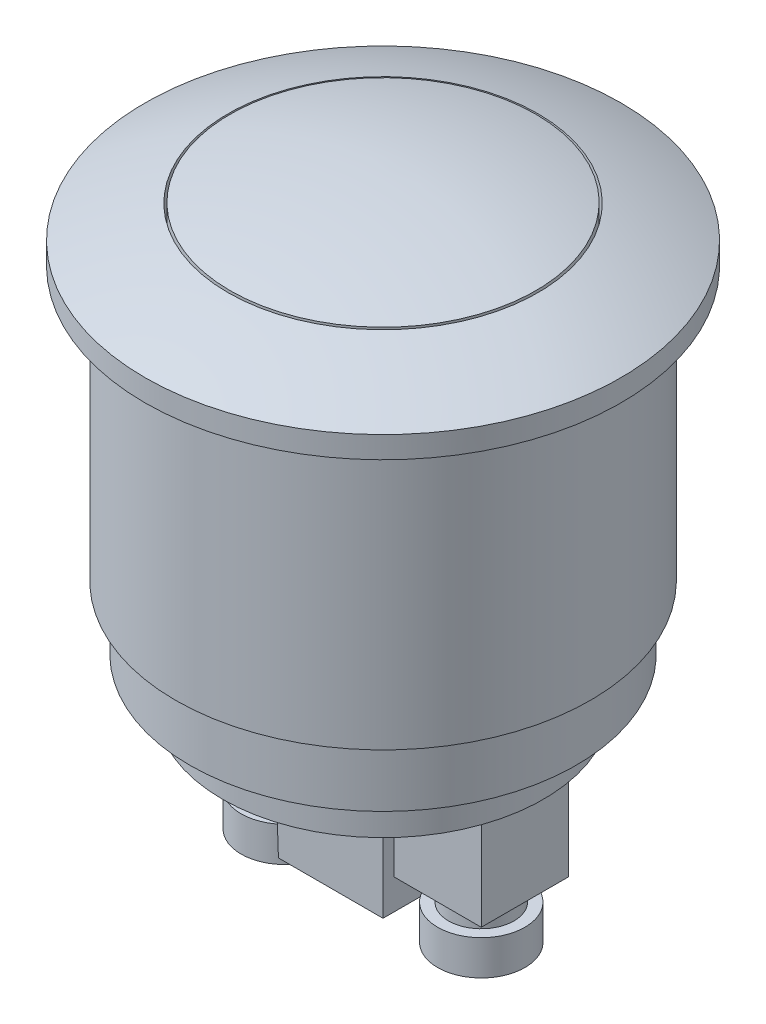
ISO-10303-21;
HEADER;
FILE_DESCRIPTION(('STEP AP214'),'2;1');
FILE_NAME('part.step','',(''),(''),'','','');
FILE_SCHEMA(('AUTOMOTIVE_DESIGN { 1 0 10303 214 1 1 1 1 }'));
ENDSEC;
DATA;
#1=APPLICATION_CONTEXT('core data for automotive mechanical design processes');
#2=APPLICATION_PROTOCOL_DEFINITION('international standard','automotive_design',2000,#1);
#3=PRODUCT_CONTEXT('',#1,'mechanical');
#4=PRODUCT('Part','Part','',(#3));
#5=PRODUCT_RELATED_PRODUCT_CATEGORY('part','',(#4));
#6=PRODUCT_DEFINITION_FORMATION('','',#4);
#7=PRODUCT_DEFINITION_CONTEXT('part definition',#1,'design');
#8=PRODUCT_DEFINITION('design','',#6,#7);
#9=PRODUCT_DEFINITION_SHAPE('','',#8);
#10=(LENGTH_UNIT() NAMED_UNIT(*) SI_UNIT(.MILLI.,.METRE.));
#11=(NAMED_UNIT(*) PLANE_ANGLE_UNIT() SI_UNIT($,.RADIAN.));
#12=(NAMED_UNIT(*) SI_UNIT($,.STERADIAN.) SOLID_ANGLE_UNIT());
#13=UNCERTAINTY_MEASURE_WITH_UNIT(LENGTH_MEASURE(1.E-05),#10,'distance_accuracy_value','');
#14=(GEOMETRIC_REPRESENTATION_CONTEXT(3) GLOBAL_UNCERTAINTY_ASSIGNED_CONTEXT((#13)) GLOBAL_UNIT_ASSIGNED_CONTEXT((#10,
#11,#12)) REPRESENTATION_CONTEXT('',''));
#15=CARTESIAN_POINT('',(0.,0.,0.));
#16=DIRECTION('',(0.,0.,1.));
#17=DIRECTION('',(1.,0.,0.));
#18=AXIS2_PLACEMENT_3D('',#15,#16,#17);
#19=CARTESIAN_POINT('',(0.,-22.,0.));
#20=DIRECTION('',(0.,-1.,0.));
#21=DIRECTION('',(0.,0.,-1.));
#22=AXIS2_PLACEMENT_3D('',#19,#20,#21);
#23=PLANE('',#22);
#24=DIRECTION('',(0.,0.,1.));
#25=VECTOR('',#24,1.);
#26=CARTESIAN_POINT('',(6.5,-22.,0.));
#27=LINE('',#26,#25);
#28=CARTESIAN_POINT('',(6.5,-22.,-2.));
#29=VERTEX_POINT('',#28);
#30=CARTESIAN_POINT('',(6.5,-22.,2.));
#31=VERTEX_POINT('',#30);
#32=EDGE_CURVE('E145',#29,#31,#27,.T.);
#33=ORIENTED_EDGE('',*,*,#32,.T.);
#34=DIRECTION('',(-1.,0.,0.));
#35=VECTOR('',#34,1.);
#36=CARTESIAN_POINT('',(0.,-22.,2.));
#37=LINE('',#36,#35);
#38=CARTESIAN_POINT('',(2.5,-22.,2.));
#39=VERTEX_POINT('',#38);
#40=EDGE_CURVE('E135',#31,#39,#37,.T.);
#41=ORIENTED_EDGE('',*,*,#40,.T.);
#42=DIRECTION('',(0.,0.,-1.));
#43=VECTOR('',#42,1.);
#44=CARTESIAN_POINT('',(2.5,-22.,0.));
#45=LINE('',#44,#43);
#46=CARTESIAN_POINT('',(2.5,-22.,-2.));
#47=VERTEX_POINT('',#46);
#48=EDGE_CURVE('E144',#39,#47,#45,.T.);
#49=ORIENTED_EDGE('',*,*,#48,.T.);
#50=DIRECTION('',(1.,0.,0.));
#51=VECTOR('',#50,1.);
#52=CARTESIAN_POINT('',(0.,-22.,-2.));
#53=LINE('',#52,#51);
#54=EDGE_CURVE('E150',#47,#29,#53,.T.);
#55=ORIENTED_EDGE('',*,*,#54,.T.);
#56=EDGE_LOOP('',(#33,#41,#49,#55));
#57=FACE_BOUND('',#56,.T.);
#58=CARTESIAN_POINT('',(4.5,-22.,0.));
#59=DIRECTION('',(0.,-1.,0.));
#60=DIRECTION('',(0.,0.,1.));
#61=AXIS2_PLACEMENT_3D('',#58,#59,#60);
#62=CIRCLE('',#61,1.5);
#63=CARTESIAN_POINT('',(4.5,-22.,1.5));
#64=VERTEX_POINT('',#63);
#65=EDGE_CURVE('E278',#64,#64,#62,.T.);
#66=ORIENTED_EDGE('',*,*,#65,.F.);
#67=EDGE_LOOP('',(#66));
#68=FACE_BOUND('',#67,.T.);
#69=ADVANCED_FACE('F41',(#57,#68),#23,.T.);
#70=CARTESIAN_POINT('',(0.,-17.5,0.));
#71=DIRECTION('',(0.,1.,0.));
#72=DIRECTION('',(0.,0.,1.));
#73=AXIS2_PLACEMENT_3D('',#70,#71,#72);
#74=PLANE('',#73);
#75=CARTESIAN_POINT('',(0.,-17.5,0.));
#76=DIRECTION('',(0.,1.,0.));
#77=DIRECTION('',(0.,0.,1.));
#78=AXIS2_PLACEMENT_3D('',#75,#76,#77);
#79=CIRCLE('',#78,7.35);
#80=CARTESIAN_POINT('',(0.,-17.5,7.35));
#81=VERTEX_POINT('',#80);
#82=EDGE_CURVE('E212',#81,#81,#79,.T.);
#83=ORIENTED_EDGE('',*,*,#82,.F.);
#84=EDGE_LOOP('',(#83));
#85=FACE_BOUND('',#84,.T.);
#86=DIRECTION('',(-1.,0.,0.));
#87=VECTOR('',#86,1.);
#88=CARTESIAN_POINT('',(0.,-17.5,2.));
#89=LINE('',#88,#87);
#90=CARTESIAN_POINT('',(6.5,-17.5,2.));
#91=VERTEX_POINT('',#90);
#92=CARTESIAN_POINT('',(2.5,-17.5,2.));
#93=VERTEX_POINT('',#92);
#94=EDGE_CURVE('E58',#91,#93,#89,.T.);
#95=ORIENTED_EDGE('',*,*,#94,.F.);
#96=DIRECTION('',(0.,0.,1.));
#97=VECTOR('',#96,1.);
#98=CARTESIAN_POINT('',(6.5,-17.5,0.));
#99=LINE('',#98,#97);
#100=CARTESIAN_POINT('',(6.5,-17.5,-2.));
#101=VERTEX_POINT('',#100);
#102=EDGE_CURVE('E63',#101,#91,#99,.T.);
#103=ORIENTED_EDGE('',*,*,#102,.F.);
#104=DIRECTION('',(1.,0.,0.));
#105=VECTOR('',#104,1.);
#106=CARTESIAN_POINT('',(0.,-17.5,-2.));
#107=LINE('',#106,#105);
#108=CARTESIAN_POINT('',(2.5,-17.5,-2.));
#109=VERTEX_POINT('',#108);
#110=EDGE_CURVE('E154',#109,#101,#107,.T.);
#111=ORIENTED_EDGE('',*,*,#110,.F.);
#112=DIRECTION('',(0.,0.,-1.));
#113=VECTOR('',#112,1.);
#114=CARTESIAN_POINT('',(2.5,-17.5,0.));
#115=LINE('',#114,#113);
#116=CARTESIAN_POINT('',(2.5,-17.5,-2.5));
#117=VERTEX_POINT('',#116);
#118=EDGE_CURVE('E187',#109,#117,#115,.T.);
#119=ORIENTED_EDGE('',*,*,#118,.T.);
#120=DIRECTION('',(-1.,0.,0.));
#121=VECTOR('',#120,1.);
#122=CARTESIAN_POINT('',(0.,-17.5,-2.5));
#123=LINE('',#122,#121);
#124=CARTESIAN_POINT('',(-2.5,-17.5,-2.5));
#125=VERTEX_POINT('',#124);
#126=EDGE_CURVE('E198',#117,#125,#123,.T.);
#127=ORIENTED_EDGE('',*,*,#126,.T.);
#128=DIRECTION('',(0.,0.,1.));
#129=VECTOR('',#128,1.);
#130=CARTESIAN_POINT('',(-2.5,-17.5,0.));
#131=LINE('',#130,#129);
#132=CARTESIAN_POINT('',(-2.5,-17.5,-2.));
#133=VERTEX_POINT('',#132);
#134=EDGE_CURVE('E203',#125,#133,#131,.T.);
#135=ORIENTED_EDGE('',*,*,#134,.T.);
#136=DIRECTION('',(-1.,0.,0.));
#137=VECTOR('',#136,1.);
#138=CARTESIAN_POINT('',(0.,-17.5,-2.));
#139=LINE('',#138,#137);
#140=CARTESIAN_POINT('',(-6.5,-17.5,-2.));
#141=VERTEX_POINT('',#140);
#142=EDGE_CURVE('E159',#133,#141,#139,.T.);
#143=ORIENTED_EDGE('',*,*,#142,.T.);
#144=DIRECTION('',(0.,0.,1.));
#145=VECTOR('',#144,1.);
#146=CARTESIAN_POINT('',(-6.5,-17.5,0.));
#147=LINE('',#146,#145);
#148=CARTESIAN_POINT('',(-6.5,-17.5,2.));
#149=VERTEX_POINT('',#148);
#150=EDGE_CURVE('E180',#141,#149,#147,.T.);
#151=ORIENTED_EDGE('',*,*,#150,.T.);
#152=DIRECTION('',(1.,0.,0.));
#153=VECTOR('',#152,1.);
#154=CARTESIAN_POINT('',(0.,-17.5,2.));
#155=LINE('',#154,#153);
#156=CARTESIAN_POINT('',(-2.5,-17.5,2.));
#157=VERTEX_POINT('',#156);
#158=EDGE_CURVE('E169',#149,#157,#155,.T.);
#159=ORIENTED_EDGE('',*,*,#158,.T.);
#160=CARTESIAN_POINT('',(-2.5,-17.5,2.5));
#161=VERTEX_POINT('',#160);
#162=EDGE_CURVE('E202',#157,#161,#131,.T.);
#163=ORIENTED_EDGE('',*,*,#162,.T.);
#164=DIRECTION('',(1.,0.,0.));
#165=VECTOR('',#164,1.);
#166=CARTESIAN_POINT('',(0.,-17.5,2.5));
#167=LINE('',#166,#165);
#168=CARTESIAN_POINT('',(2.5,-17.5,2.5));
#169=VERTEX_POINT('',#168);
#170=EDGE_CURVE('E206',#161,#169,#167,.T.);
#171=ORIENTED_EDGE('',*,*,#170,.T.);
#172=EDGE_CURVE('E196',#169,#93,#115,.T.);
#173=ORIENTED_EDGE('',*,*,#172,.T.);
#174=EDGE_LOOP('',(#95,#103,#111,#119,#127,#135,#143,#151,#159,#163,#171,#173));
#175=FACE_BOUND('',#174,.T.);
#176=ADVANCED_FACE('F325',(#85,#175),#74,.F.);
#177=CARTESIAN_POINT('',(0.,1.,0.));
#178=DIRECTION('',(0.,-1.,0.));
#179=DIRECTION('',(0.,0.,-1.));
#180=AXIS2_PLACEMENT_3D('',#177,#178,#179);
#181=CYLINDRICAL_SURFACE('',#180,10.9);
#182=CARTESIAN_POINT('',(0.,1.,0.));
#183=DIRECTION('',(0.,1.,0.));
#184=DIRECTION('',(0.,0.,1.));
#185=AXIS2_PLACEMENT_3D('',#182,#183,#184);
#186=CIRCLE('',#185,10.9);
#187=CARTESIAN_POINT('',(0.,1.,10.9));
#188=VERTEX_POINT('',#187);
#189=EDGE_CURVE('E11',#188,#188,#186,.T.);
#190=ORIENTED_EDGE('',*,*,#189,.F.);
#191=EDGE_LOOP('',(#190));
#192=FACE_BOUND('',#191,.T.);
#193=CARTESIAN_POINT('',(0.,0.,0.));
#194=DIRECTION('',(0.,1.,0.));
#195=DIRECTION('',(0.,0.,1.));
#196=AXIS2_PLACEMENT_3D('',#193,#194,#195);
#197=CIRCLE('',#196,10.9);
#198=CARTESIAN_POINT('',(0.,0.,10.9));
#199=VERTEX_POINT('',#198);
#200=EDGE_CURVE('E50',#199,#199,#197,.T.);
#201=ORIENTED_EDGE('',*,*,#200,.T.);
#202=EDGE_LOOP('',(#201));
#203=FACE_BOUND('',#202,.T.);
#204=ADVANCED_FACE('F372',(#192,#203),#181,.T.);
#205=CARTESIAN_POINT('',(0.,-21.512,0.));
#206=DIRECTION('',(0.,0.,1.));
#207=DIRECTION('',(1.,0.,0.));
#208=AXIS2_PLACEMENT_3D('',#205,#206,#207);
#209=SPHERICAL_SURFACE('',#208,25.012);
#210=CARTESIAN_POINT('',(0.,-21.512,0.));
#211=DIRECTION('',(0.,-1.,0.));
#212=DIRECTION('',(0.,0.,-1.));
#213=AXIS2_PLACEMENT_3D('',#210,#211,#212);
#214=SPHERICAL_SURFACE('',#213,25.012);
#215=CARTESIAN_POINT('',(0.,2.47112206531919,0.));
#216=DIRECTION('',(0.,-1.,0.));
#217=DIRECTION('',(0.,0.,-1.));
#218=AXIS2_PLACEMENT_3D('',#215,#216,#217);
#219=CIRCLE('',#218,7.1);
#220=CARTESIAN_POINT('',(0.,2.47112206531919,-7.1));
#221=VERTEX_POINT('',#220);
#222=EDGE_CURVE('E45',#221,#221,#219,.F.);
#223=ORIENTED_EDGE('',*,*,#222,.F.);
#224=EDGE_LOOP('',(#223));
#225=FACE_BOUND('',#224,.T.);
#226=ORIENTED_EDGE('',*,*,#189,.T.);
#227=EDGE_LOOP('',(#226));
#228=FACE_BOUND('',#227,.T.);
#229=ADVANCED_FACE('F43',(#225,#228),#214,.T.);
#230=CARTESIAN_POINT('',(0.,0.,0.));
#231=DIRECTION('',(0.,1.,0.));
#232=DIRECTION('',(0.,0.,1.));
#233=AXIS2_PLACEMENT_3D('',#230,#231,#232);
#234=PLANE('',#233);
#235=CARTESIAN_POINT('',(0.,0.,0.));
#236=DIRECTION('',(0.,1.,0.));
#237=DIRECTION('',(0.,0.,1.));
#238=AXIS2_PLACEMENT_3D('',#235,#236,#237);
#239=CIRCLE('',#238,9.5);
#240=CARTESIAN_POINT('',(0.,0.,9.5));
#241=VERTEX_POINT('',#240);
#242=EDGE_CURVE('E247',#241,#241,#239,.T.);
#243=ORIENTED_EDGE('',*,*,#242,.T.);
#244=EDGE_LOOP('',(#243));
#245=FACE_BOUND('',#244,.T.);
#246=ORIENTED_EDGE('',*,*,#200,.F.);
#247=EDGE_LOOP('',(#246));
#248=FACE_BOUND('',#247,.T.);
#249=ADVANCED_FACE('F505',(#245,#248),#234,.F.);
#250=CARTESIAN_POINT('',(0.,-12.5,0.));
#251=DIRECTION('',(0.,1.,0.));
#252=DIRECTION('',(0.,0.,1.));
#253=AXIS2_PLACEMENT_3D('',#250,#251,#252);
#254=CYLINDRICAL_SURFACE('',#253,9.5);
#255=CARTESIAN_POINT('',(0.,-12.5,0.));
#256=DIRECTION('',(0.,1.,0.));
#257=DIRECTION('',(0.,0.,1.));
#258=AXIS2_PLACEMENT_3D('',#255,#256,#257);
#259=CIRCLE('',#258,9.5);
#260=CARTESIAN_POINT('',(0.,-12.5,9.5));
#261=VERTEX_POINT('',#260);
#262=EDGE_CURVE('E243',#261,#261,#259,.T.);
#263=ORIENTED_EDGE('',*,*,#262,.T.);
#264=EDGE_LOOP('',(#263));
#265=FACE_BOUND('',#264,.T.);
#266=ORIENTED_EDGE('',*,*,#242,.F.);
#267=EDGE_LOOP('',(#266));
#268=FACE_BOUND('',#267,.T.);
#269=ADVANCED_FACE('F652',(#265,#268),#254,.T.);
#270=CARTESIAN_POINT('',(0.,-12.5,0.));
#271=DIRECTION('',(0.,1.,0.));
#272=DIRECTION('',(0.,0.,1.));
#273=AXIS2_PLACEMENT_3D('',#270,#271,#272);
#274=PLANE('',#273);
#275=CARTESIAN_POINT('',(0.,-12.5,0.));
#276=DIRECTION('',(0.,1.,0.));
#277=DIRECTION('',(0.,0.,1.));
#278=AXIS2_PLACEMENT_3D('',#275,#276,#277);
#279=CIRCLE('',#278,8.85);
#280=CARTESIAN_POINT('',(0.,-12.5,8.85));
#281=VERTEX_POINT('',#280);
#282=EDGE_CURVE('E242',#281,#281,#279,.T.);
#283=ORIENTED_EDGE('',*,*,#282,.T.);
#284=EDGE_LOOP('',(#283));
#285=FACE_BOUND('',#284,.T.);
#286=ORIENTED_EDGE('',*,*,#262,.F.);
#287=EDGE_LOOP('',(#286));
#288=FACE_BOUND('',#287,.T.);
#289=ADVANCED_FACE('F643',(#285,#288),#274,.F.);
#290=CARTESIAN_POINT('',(0.,-15.4,0.));
#291=DIRECTION('',(0.,1.,0.));
#292=DIRECTION('',(0.,0.,1.));
#293=AXIS2_PLACEMENT_3D('',#290,#291,#292);
#294=CYLINDRICAL_SURFACE('',#293,8.85);
#295=CARTESIAN_POINT('',(0.,-15.4,0.));
#296=DIRECTION('',(0.,1.,0.));
#297=DIRECTION('',(0.,0.,1.));
#298=AXIS2_PLACEMENT_3D('',#295,#296,#297);
#299=CIRCLE('',#298,8.85);
#300=CARTESIAN_POINT('',(0.,-15.4,8.85));
#301=VERTEX_POINT('',#300);
#302=EDGE_CURVE('E238',#301,#301,#299,.T.);
#303=CARTESIAN_POINT('',(0.,-15.4,8.85));
#304=CARTESIAN_POINT('',(0.,-15.3697916666667,8.85));
#305=CARTESIAN_POINT('',(0.,-15.3395833333333,8.85));
#306=CARTESIAN_POINT('',(0.,-15.2791666666667,8.85));
#307=CARTESIAN_POINT('',(0.,-15.2489583333333,8.85));
#308=CARTESIAN_POINT('',(0.,-15.1885416666667,8.85));
#309=CARTESIAN_POINT('',(0.,-15.1583333333333,8.85));
#310=CARTESIAN_POINT('',(0.,-15.0979166666667,8.85));
#311=CARTESIAN_POINT('',(0.,-15.0677083333333,8.85));
#312=CARTESIAN_POINT('',(0.,-15.0072916666667,8.85));
#313=CARTESIAN_POINT('',(0.,-14.9770833333333,8.85));
#314=CARTESIAN_POINT('',(0.,-14.9166666666667,8.85));
#315=CARTESIAN_POINT('',(0.,-14.8864583333333,8.85));
#316=CARTESIAN_POINT('',(0.,-14.8260416666667,8.85));
#317=CARTESIAN_POINT('',(0.,-14.7958333333333,8.85));
#318=CARTESIAN_POINT('',(0.,-14.7354166666667,8.85));
#319=CARTESIAN_POINT('',(0.,-14.7052083333333,8.85));
#320=CARTESIAN_POINT('',(0.,-14.6447916666667,8.85));
#321=CARTESIAN_POINT('',(0.,-14.6145833333333,8.85));
#322=CARTESIAN_POINT('',(0.,-14.5541666666667,8.85));
#323=CARTESIAN_POINT('',(0.,-14.5239583333333,8.85));
#324=CARTESIAN_POINT('',(0.,-14.4635416666667,8.85));
#325=CARTESIAN_POINT('',(0.,-14.4333333333333,8.85));
#326=CARTESIAN_POINT('',(0.,-14.3729166666667,8.85));
#327=CARTESIAN_POINT('',(0.,-14.3427083333333,8.85));
#328=CARTESIAN_POINT('',(0.,-14.2822916666667,8.85));
#329=CARTESIAN_POINT('',(0.,-14.2520833333333,8.85));
#330=CARTESIAN_POINT('',(0.,-14.1916666666667,8.85));
#331=CARTESIAN_POINT('',(0.,-14.1614583333333,8.85));
#332=CARTESIAN_POINT('',(0.,-14.1010416666667,8.85));
#333=CARTESIAN_POINT('',(0.,-14.0708333333333,8.85));
#334=CARTESIAN_POINT('',(0.,-14.0104166666667,8.85));
#335=CARTESIAN_POINT('',(0.,-13.9802083333333,8.85));
#336=CARTESIAN_POINT('',(0.,-13.9197916666667,8.85));
#337=CARTESIAN_POINT('',(0.,-13.8895833333333,8.85));
#338=CARTESIAN_POINT('',(0.,-13.8291666666667,8.85));
#339=CARTESIAN_POINT('',(0.,-13.7989583333333,8.85));
#340=CARTESIAN_POINT('',(0.,-13.7385416666667,8.85));
#341=CARTESIAN_POINT('',(0.,-13.7083333333333,8.85));
#342=CARTESIAN_POINT('',(0.,-13.6479166666667,8.85));
#343=CARTESIAN_POINT('',(0.,-13.6177083333333,8.85));
#344=CARTESIAN_POINT('',(0.,-13.5572916666667,8.85));
#345=CARTESIAN_POINT('',(0.,-13.5270833333333,8.85));
#346=CARTESIAN_POINT('',(0.,-13.4666666666667,8.85));
#347=CARTESIAN_POINT('',(0.,-13.4364583333333,8.85));
#348=CARTESIAN_POINT('',(0.,-13.3760416666667,8.85));
#349=CARTESIAN_POINT('',(0.,-13.3458333333333,8.85));
#350=CARTESIAN_POINT('',(0.,-13.2854166666667,8.85));
#351=CARTESIAN_POINT('',(0.,-13.2552083333333,8.85));
#352=CARTESIAN_POINT('',(0.,-13.1947916666667,8.85));
#353=CARTESIAN_POINT('',(0.,-13.1645833333333,8.85));
#354=CARTESIAN_POINT('',(0.,-13.1041666666667,8.85));
#355=CARTESIAN_POINT('',(0.,-13.0739583333333,8.85));
#356=CARTESIAN_POINT('',(0.,-13.0135416666667,8.85));
#357=CARTESIAN_POINT('',(0.,-12.9833333333333,8.85));
#358=CARTESIAN_POINT('',(0.,-12.9229166666667,8.85));
#359=CARTESIAN_POINT('',(0.,-12.8927083333333,8.85));
#360=CARTESIAN_POINT('',(0.,-12.8322916666667,8.85));
#361=CARTESIAN_POINT('',(0.,-12.8020833333333,8.85));
#362=CARTESIAN_POINT('',(0.,-12.7416666666667,8.85));
#363=CARTESIAN_POINT('',(0.,-12.7114583333333,8.85));
#364=CARTESIAN_POINT('',(0.,-12.6510416666667,8.85));
#365=CARTESIAN_POINT('',(0.,-12.6208333333333,8.85));
#366=CARTESIAN_POINT('',(0.,-12.5604166666667,8.85));
#367=CARTESIAN_POINT('',(0.,-12.5302083333333,8.85));
#368=CARTESIAN_POINT('',(0.,-12.5,8.85));
#369=B_SPLINE_CURVE_WITH_KNOTS('',3,(#303,#304,#305,#306,#307,#308,#309,#310,#311,#312,#313,
#314,#315,#316,#317,#318,#319,#320,#321,#322,#323,#324,#325,#326,#327,#328,#329,#330,#331,#332,
#333,#334,#335,#336,#337,#338,#339,#340,#341,#342,#343,#344,#345,#346,#347,#348,#349,#350,#351,
#352,#353,#354,#355,#356,#357,#358,#359,#360,#361,#362,#363,#364,#365,#366,#367,#368),
.UNSPECIFIED.,.F.,.F.,(4,2,2,2,2,2,2,2,2,2,2,2,2,2,2,2,2,2,2,2,2,2,2,2,2,2,2,2,2,2,2,2,4),(0.,
0.0906250000000004,0.181250000000001,0.271875000000001,0.3625,0.453125,0.543750000000001,
0.634375000000001,0.725,0.815625,0.906250000000001,0.996875000000001,1.0875,1.178125,1.26875,
1.359375,1.45,1.540625,1.63125,1.721875,1.8125,1.903125,1.99375,2.084375,2.175,2.265625,2.35625,
2.446875,2.5375,2.628125,2.71875,2.809375,2.9),.UNSPECIFIED.);
#370=EDGE_CURVE('BSEAM634',#301,#281,#369,.T.);
#371=ORIENTED_EDGE('',*,*,#302,.T.);
#372=ORIENTED_EDGE('',*,*,#282,.F.);
#373=ORIENTED_EDGE('',*,*,#370,.T.);
#374=ORIENTED_EDGE('',*,*,#370,.F.);
#375=EDGE_LOOP('',(#371,#373,#372,#374));
#376=FACE_BOUND('',#375,.T.);
#377=ADVANCED_FACE('F634',(#376),#294,.T.);
#378=CARTESIAN_POINT('',(0.,-15.4,0.));
#379=DIRECTION('',(0.,1.,0.));
#380=DIRECTION('',(0.,0.,1.));
#381=AXIS2_PLACEMENT_3D('',#378,#379,#380);
#382=PLANE('',#381);
#383=CARTESIAN_POINT('',(0.,-15.4,0.));
#384=DIRECTION('',(0.,1.,0.));
#385=DIRECTION('',(0.,0.,1.));
#386=AXIS2_PLACEMENT_3D('',#383,#384,#385);
#387=CIRCLE('',#386,7.35);
#388=CARTESIAN_POINT('',(0.,-15.4,7.35));
#389=VERTEX_POINT('',#388);
#390=EDGE_CURVE('E237',#389,#389,#387,.T.);
#391=ORIENTED_EDGE('',*,*,#390,.T.);
#392=EDGE_LOOP('',(#391));
#393=FACE_BOUND('',#392,.T.);
#394=ORIENTED_EDGE('',*,*,#302,.F.);
#395=EDGE_LOOP('',(#394));
#396=FACE_BOUND('',#395,.T.);
#397=ADVANCED_FACE('F625',(#393,#396),#382,.F.);
#398=CARTESIAN_POINT('',(0.,-17.5,0.));
#399=DIRECTION('',(0.,1.,0.));
#400=DIRECTION('',(0.,0.,1.));
#401=AXIS2_PLACEMENT_3D('',#398,#399,#400);
#402=CYLINDRICAL_SURFACE('',#401,7.35);
#403=ORIENTED_EDGE('',*,*,#82,.T.);
#404=EDGE_LOOP('',(#403));
#405=FACE_BOUND('',#404,.T.);
#406=ORIENTED_EDGE('',*,*,#390,.F.);
#407=EDGE_LOOP('',(#406));
#408=FACE_BOUND('',#407,.T.);
#409=ADVANCED_FACE('F618',(#405,#408),#402,.T.);
#410=CARTESIAN_POINT('',(2.5,-17.5,0.));
#411=DIRECTION('',(0.999847695156391,-0.0174524064372835,0.));
#412=DIRECTION('',(0.0174524064372835,0.999847695156391,0.));
#413=AXIS2_PLACEMENT_3D('',#410,#411,#412);
#414=PLANE('',#413);
#415=ORIENTED_EDGE('',*,*,#172,.F.);
#416=DIRECTION('',(0.0174497491606827,0.999695459881887,0.0174497491606827));
#417=VECTOR('',#416,1.);
#418=CARTESIAN_POINT('',(2.49923876563557,-17.54361108753,2.49923876563557));
#419=LINE('',#418,#417);
#420=CARTESIAN_POINT('',(2.39526961043069,-23.5,2.39526961043069));
#421=VERTEX_POINT('',#420);
#422=EDGE_CURVE('E210',#421,#169,#419,.T.);
#423=ORIENTED_EDGE('',*,*,#422,.F.);
#424=DIRECTION('',(0.,0.,-1.));
#425=VECTOR('',#424,1.);
#426=CARTESIAN_POINT('',(2.39526961043069,-23.5,0.));
#427=LINE('',#426,#425);
#428=CARTESIAN_POINT('',(2.39526961043069,-23.5,-2.39526961043069));
#429=VERTEX_POINT('',#428);
#430=EDGE_CURVE('E209',#421,#429,#427,.T.);
#431=ORIENTED_EDGE('',*,*,#430,.T.);
#432=DIRECTION('',(0.0174497491606827,0.999695459881887,-0.0174497491606827));
#433=VECTOR('',#432,1.);
#434=CARTESIAN_POINT('',(2.49923876563557,-17.54361108753,-2.49923876563557));
#435=LINE('',#434,#433);
#436=EDGE_CURVE('E214',#429,#117,#435,.T.);
#437=ORIENTED_EDGE('',*,*,#436,.T.);
#438=ORIENTED_EDGE('',*,*,#118,.F.);
#439=DIRECTION('',(0.,0.,-1.));
#440=VECTOR('',#439,1.);
#441=CARTESIAN_POINT('',(2.5,-17.5,0.));
#442=LINE('',#441,#440);
#443=EDGE_CURVE('E308',#93,#109,#442,.T.);
#444=ORIENTED_EDGE('',*,*,#443,.F.);
#445=EDGE_LOOP('',(#415,#423,#431,#437,#438,#444));
#446=FACE_BOUND('',#445,.T.);
#447=ADVANCED_FACE('F324',(#446),#414,.T.);
#448=CARTESIAN_POINT('',(0.,-17.5,2.5));
#449=DIRECTION('',(0.,-0.0174524064372835,0.999847695156391));
#450=DIRECTION('',(0.,-0.999847695156391,-0.0174524064372835));
#451=AXIS2_PLACEMENT_3D('',#448,#449,#450);
#452=PLANE('',#451);
#453=ORIENTED_EDGE('',*,*,#170,.F.);
#454=DIRECTION('',(-0.0174497491606827,0.999695459881887,0.0174497491606827));
#455=VECTOR('',#454,1.);
#456=CARTESIAN_POINT('',(-2.49923876563557,-17.54361108753,2.49923876563557));
#457=LINE('',#456,#455);
#458=CARTESIAN_POINT('',(-2.39526961043069,-23.5,2.39526961043069));
#459=VERTEX_POINT('',#458);
#460=EDGE_CURVE('E213',#459,#161,#457,.T.);
#461=ORIENTED_EDGE('',*,*,#460,.F.);
#462=DIRECTION('',(1.,0.,0.));
#463=VECTOR('',#462,1.);
#464=CARTESIAN_POINT('',(0.,-23.5,2.39526961043069));
#465=LINE('',#464,#463);
#466=EDGE_CURVE('E219',#459,#421,#465,.T.);
#467=ORIENTED_EDGE('',*,*,#466,.T.);
#468=ORIENTED_EDGE('',*,*,#422,.T.);
#469=EDGE_LOOP('',(#453,#461,#467,#468));
#470=FACE_BOUND('',#469,.T.);
#471=ADVANCED_FACE('F328',(#470),#452,.T.);
#472=CARTESIAN_POINT('',(-2.5,-17.5,0.));
#473=DIRECTION('',(-0.999847695156391,-0.0174524064372835,0.));
#474=DIRECTION('',(0.0174524064372835,-0.999847695156391,0.));
#475=AXIS2_PLACEMENT_3D('',#472,#473,#474);
#476=PLANE('',#475);
#477=ORIENTED_EDGE('',*,*,#134,.F.);
#478=DIRECTION('',(-0.0174497491606827,0.999695459881887,-0.0174497491606827));
#479=VECTOR('',#478,1.);
#480=CARTESIAN_POINT('',(-2.49923876563557,-17.54361108753,-2.49923876563557));
#481=LINE('',#480,#479);
#482=CARTESIAN_POINT('',(-2.39526961043069,-23.5,-2.39526961043069));
#483=VERTEX_POINT('',#482);
#484=EDGE_CURVE('E218',#483,#125,#481,.T.);
#485=ORIENTED_EDGE('',*,*,#484,.F.);
#486=DIRECTION('',(0.,0.,1.));
#487=VECTOR('',#486,1.);
#488=CARTESIAN_POINT('',(-2.39526961043069,-23.5,0.));
#489=LINE('',#488,#487);
#490=EDGE_CURVE('E230',#483,#459,#489,.T.);
#491=ORIENTED_EDGE('',*,*,#490,.T.);
#492=ORIENTED_EDGE('',*,*,#460,.T.);
#493=ORIENTED_EDGE('',*,*,#162,.F.);
#494=DIRECTION('',(0.,0.,-1.));
#495=VECTOR('',#494,1.);
#496=CARTESIAN_POINT('',(-2.5,-17.5,0.));
#497=LINE('',#496,#495);
#498=EDGE_CURVE('E157',#157,#133,#497,.T.);
#499=ORIENTED_EDGE('',*,*,#498,.T.);
#500=EDGE_LOOP('',(#477,#485,#491,#492,#493,#499));
#501=FACE_BOUND('',#500,.T.);
#502=ADVANCED_FACE('F597',(#501),#476,.T.);
#503=CARTESIAN_POINT('',(0.,-17.5,-2.5));
#504=DIRECTION('',(0.,-0.0174524064372835,-0.999847695156391));
#505=DIRECTION('',(0.,0.999847695156391,-0.0174524064372835));
#506=AXIS2_PLACEMENT_3D('',#503,#504,#505);
#507=PLANE('',#506);
#508=ORIENTED_EDGE('',*,*,#126,.F.);
#509=ORIENTED_EDGE('',*,*,#436,.F.);
#510=DIRECTION('',(-1.,0.,0.));
#511=VECTOR('',#510,1.);
#512=CARTESIAN_POINT('',(0.,-23.5,-2.39526961043069));
#513=LINE('',#512,#511);
#514=EDGE_CURVE('E227',#429,#483,#513,.T.);
#515=ORIENTED_EDGE('',*,*,#514,.T.);
#516=ORIENTED_EDGE('',*,*,#484,.T.);
#517=EDGE_LOOP('',(#508,#509,#515,#516));
#518=FACE_BOUND('',#517,.T.);
#519=ADVANCED_FACE('F337',(#518),#507,.T.);
#520=CARTESIAN_POINT('',(0.,-23.5,0.));
#521=DIRECTION('',(0.,1.,0.));
#522=DIRECTION('',(0.,0.,1.));
#523=AXIS2_PLACEMENT_3D('',#520,#521,#522);
#524=PLANE('',#523);
#525=ORIENTED_EDGE('',*,*,#430,.F.);
#526=ORIENTED_EDGE('',*,*,#466,.F.);
#527=ORIENTED_EDGE('',*,*,#490,.F.);
#528=ORIENTED_EDGE('',*,*,#514,.F.);
#529=EDGE_LOOP('',(#525,#526,#527,#528));
#530=FACE_BOUND('',#529,.T.);
#531=ADVANCED_FACE('F333',(#530),#524,.F.);
#532=CARTESIAN_POINT('',(-2.5,-22.,0.));
#533=DIRECTION('',(1.,0.,0.));
#534=DIRECTION('',(0.,0.,-1.));
#535=AXIS2_PLACEMENT_3D('',#532,#533,#534);
#536=PLANE('',#535);
#537=ORIENTED_EDGE('',*,*,#498,.F.);
#538=DIRECTION('',(0.,1.,0.));
#539=VECTOR('',#538,1.);
#540=CARTESIAN_POINT('',(-2.5,-22.,2.));
#541=LINE('',#540,#539);
#542=CARTESIAN_POINT('',(-2.5,-22.,2.));
#543=VERTEX_POINT('',#542);
#544=EDGE_CURVE('E184',#543,#157,#541,.T.);
#545=ORIENTED_EDGE('',*,*,#544,.F.);
#546=DIRECTION('',(0.,0.,-1.));
#547=VECTOR('',#546,1.);
#548=CARTESIAN_POINT('',(-2.5,-22.,0.));
#549=LINE('',#548,#547);
#550=CARTESIAN_POINT('',(-2.5,-22.,-2.));
#551=VERTEX_POINT('',#550);
#552=EDGE_CURVE('E165',#543,#551,#549,.T.);
#553=ORIENTED_EDGE('',*,*,#552,.T.);
#554=DIRECTION('',(0.,1.,0.));
#555=VECTOR('',#554,1.);
#556=CARTESIAN_POINT('',(-2.5,-22.,-2.));
#557=LINE('',#556,#555);
#558=EDGE_CURVE('E177',#551,#133,#557,.T.);
#559=ORIENTED_EDGE('',*,*,#558,.T.);
#560=EDGE_LOOP('',(#537,#545,#553,#559));
#561=FACE_BOUND('',#560,.T.);
#562=ADVANCED_FACE('F342',(#561),#536,.T.);
#563=CARTESIAN_POINT('',(0.,-22.,2.));
#564=DIRECTION('',(0.,0.,1.));
#565=DIRECTION('',(1.,0.,0.));
#566=AXIS2_PLACEMENT_3D('',#563,#564,#565);
#567=PLANE('',#566);
#568=ORIENTED_EDGE('',*,*,#158,.F.);
#569=DIRECTION('',(0.,1.,0.));
#570=VECTOR('',#569,1.);
#571=CARTESIAN_POINT('',(-6.5,-22.,2.));
#572=LINE('',#571,#570);
#573=CARTESIAN_POINT('',(-6.5,-22.,2.));
#574=VERTEX_POINT('',#573);
#575=EDGE_CURVE('E188',#574,#149,#572,.T.);
#576=ORIENTED_EDGE('',*,*,#575,.F.);
#577=DIRECTION('',(1.,0.,0.));
#578=VECTOR('',#577,1.);
#579=CARTESIAN_POINT('',(0.,-22.,2.));
#580=LINE('',#579,#578);
#581=EDGE_CURVE('E175',#574,#543,#580,.T.);
#582=ORIENTED_EDGE('',*,*,#581,.T.);
#583=ORIENTED_EDGE('',*,*,#544,.T.);
#584=EDGE_LOOP('',(#568,#576,#582,#583));
#585=FACE_BOUND('',#584,.T.);
#586=ADVANCED_FACE('F353',(#585),#567,.T.);
#587=CARTESIAN_POINT('',(-6.5,-22.,0.));
#588=DIRECTION('',(-1.,0.,0.));
#589=DIRECTION('',(0.,0.,1.));
#590=AXIS2_PLACEMENT_3D('',#587,#588,#589);
#591=PLANE('',#590);
#592=ORIENTED_EDGE('',*,*,#150,.F.);
#593=DIRECTION('',(0.,1.,0.));
#594=VECTOR('',#593,1.);
#595=CARTESIAN_POINT('',(-6.5,-22.,-2.));
#596=LINE('',#595,#594);
#597=CARTESIAN_POINT('',(-6.5,-22.,-2.));
#598=VERTEX_POINT('',#597);
#599=EDGE_CURVE('E191',#598,#141,#596,.T.);
#600=ORIENTED_EDGE('',*,*,#599,.F.);
#601=DIRECTION('',(0.,0.,1.));
#602=VECTOR('',#601,1.);
#603=CARTESIAN_POINT('',(-6.5,-22.,0.));
#604=LINE('',#603,#602);
#605=EDGE_CURVE('E172',#598,#574,#604,.T.);
#606=ORIENTED_EDGE('',*,*,#605,.T.);
#607=ORIENTED_EDGE('',*,*,#575,.T.);
#608=EDGE_LOOP('',(#592,#600,#606,#607));
#609=FACE_BOUND('',#608,.T.);
#610=ADVANCED_FACE('F350',(#609),#591,.T.);
#611=CARTESIAN_POINT('',(0.,-22.,-2.));
#612=DIRECTION('',(0.,0.,-1.));
#613=DIRECTION('',(-1.,0.,0.));
#614=AXIS2_PLACEMENT_3D('',#611,#612,#613);
#615=PLANE('',#614);
#616=ORIENTED_EDGE('',*,*,#142,.F.);
#617=ORIENTED_EDGE('',*,*,#558,.F.);
#618=DIRECTION('',(-1.,0.,0.));
#619=VECTOR('',#618,1.);
#620=CARTESIAN_POINT('',(0.,-22.,-2.));
#621=LINE('',#620,#619);
#622=EDGE_CURVE('E168',#551,#598,#621,.T.);
#623=ORIENTED_EDGE('',*,*,#622,.T.);
#624=ORIENTED_EDGE('',*,*,#599,.T.);
#625=EDGE_LOOP('',(#616,#617,#623,#624));
#626=FACE_BOUND('',#625,.T.);
#627=ADVANCED_FACE('F346',(#626),#615,.T.);
#628=CARTESIAN_POINT('',(0.,-22.,0.));
#629=DIRECTION('',(0.,1.,0.));
#630=DIRECTION('',(0.,0.,1.));
#631=AXIS2_PLACEMENT_3D('',#628,#629,#630);
#632=PLANE('',#631);
#633=CARTESIAN_POINT('',(-4.5,-22.,0.));
#634=DIRECTION('',(0.,1.,0.));
#635=DIRECTION('',(0.,0.,1.));
#636=AXIS2_PLACEMENT_3D('',#633,#634,#635);
#637=CIRCLE('',#636,1.5);
#638=CARTESIAN_POINT('',(-4.5,-22.,1.5));
#639=VERTEX_POINT('',#638);
#640=EDGE_CURVE('E298',#639,#639,#637,.T.);
#641=ORIENTED_EDGE('',*,*,#640,.T.);
#642=EDGE_LOOP('',(#641));
#643=FACE_BOUND('',#642,.T.);
#644=ORIENTED_EDGE('',*,*,#552,.F.);
#645=ORIENTED_EDGE('',*,*,#581,.F.);
#646=ORIENTED_EDGE('',*,*,#605,.F.);
#647=ORIENTED_EDGE('',*,*,#622,.F.);
#648=EDGE_LOOP('',(#644,#645,#646,#647));
#649=FACE_BOUND('',#648,.T.);
#650=ADVANCED_FACE('F356',(#643,#649),#632,.F.);
#651=CARTESIAN_POINT('',(6.5,-22.,0.));
#652=DIRECTION('',(-1.,0.,0.));
#653=DIRECTION('',(0.,0.,1.));
#654=AXIS2_PLACEMENT_3D('',#651,#652,#653);
#655=PLANE('',#654);
#656=ORIENTED_EDGE('',*,*,#102,.T.);
#657=DIRECTION('',(0.,1.,0.));
#658=VECTOR('',#657,1.);
#659=CARTESIAN_POINT('',(6.5,-22.,2.));
#660=LINE('',#659,#658);
#661=EDGE_CURVE('E139',#31,#91,#660,.T.);
#662=ORIENTED_EDGE('',*,*,#661,.F.);
#663=ORIENTED_EDGE('',*,*,#32,.F.);
#664=DIRECTION('',(0.,1.,0.));
#665=VECTOR('',#664,1.);
#666=CARTESIAN_POINT('',(6.5,-22.,-2.));
#667=LINE('',#666,#665);
#668=EDGE_CURVE('E305',#29,#101,#667,.T.);
#669=ORIENTED_EDGE('',*,*,#668,.T.);
#670=EDGE_LOOP('',(#656,#662,#663,#669));
#671=FACE_BOUND('',#670,.T.);
#672=ADVANCED_FACE('F156',(#671),#655,.F.);
#673=CARTESIAN_POINT('',(0.,-22.,2.));
#674=DIRECTION('',(0.,0.,-1.));
#675=DIRECTION('',(-1.,0.,0.));
#676=AXIS2_PLACEMENT_3D('',#673,#674,#675);
#677=PLANE('',#676);
#678=ORIENTED_EDGE('',*,*,#94,.T.);
#679=DIRECTION('',(0.,1.,0.));
#680=VECTOR('',#679,1.);
#681=CARTESIAN_POINT('',(2.5,-22.,2.));
#682=LINE('',#681,#680);
#683=EDGE_CURVE('E141',#39,#93,#682,.T.);
#684=ORIENTED_EDGE('',*,*,#683,.F.);
#685=ORIENTED_EDGE('',*,*,#40,.F.);
#686=ORIENTED_EDGE('',*,*,#661,.T.);
#687=EDGE_LOOP('',(#678,#684,#685,#686));
#688=FACE_BOUND('',#687,.T.);
#689=ADVANCED_FACE('F137',(#688),#677,.F.);
#690=CARTESIAN_POINT('',(2.5,-22.,0.));
#691=DIRECTION('',(1.,0.,0.));
#692=DIRECTION('',(0.,0.,-1.));
#693=AXIS2_PLACEMENT_3D('',#690,#691,#692);
#694=PLANE('',#693);
#695=ORIENTED_EDGE('',*,*,#443,.T.);
#696=DIRECTION('',(0.,1.,0.));
#697=VECTOR('',#696,1.);
#698=CARTESIAN_POINT('',(2.5,-22.,-2.));
#699=LINE('',#698,#697);
#700=EDGE_CURVE('E161',#47,#109,#699,.T.);
#701=ORIENTED_EDGE('',*,*,#700,.F.);
#702=ORIENTED_EDGE('',*,*,#48,.F.);
#703=ORIENTED_EDGE('',*,*,#683,.T.);
#704=EDGE_LOOP('',(#695,#701,#702,#703));
#705=FACE_BOUND('',#704,.T.);
#706=ADVANCED_FACE('F321',(#705),#694,.F.);
#707=CARTESIAN_POINT('',(0.,-22.,-2.));
#708=DIRECTION('',(0.,0.,1.));
#709=DIRECTION('',(1.,0.,0.));
#710=AXIS2_PLACEMENT_3D('',#707,#708,#709);
#711=PLANE('',#710);
#712=ORIENTED_EDGE('',*,*,#110,.T.);
#713=ORIENTED_EDGE('',*,*,#668,.F.);
#714=ORIENTED_EDGE('',*,*,#54,.F.);
#715=ORIENTED_EDGE('',*,*,#700,.T.);
#716=EDGE_LOOP('',(#712,#713,#714,#715));
#717=FACE_BOUND('',#716,.T.);
#718=ADVANCED_FACE('F319',(#717),#711,.F.);
#719=CARTESIAN_POINT('',(-4.5,-23.,0.));
#720=DIRECTION('',(0.,1.,0.));
#721=DIRECTION('',(0.,0.,1.));
#722=AXIS2_PLACEMENT_3D('',#719,#720,#721);
#723=CYLINDRICAL_SURFACE('',#722,1.5);
#724=CARTESIAN_POINT('',(-4.5,-23.,0.));
#725=DIRECTION('',(0.,1.,0.));
#726=DIRECTION('',(0.,0.,1.));
#727=AXIS2_PLACEMENT_3D('',#724,#725,#726);
#728=CIRCLE('',#727,1.5);
#729=CARTESIAN_POINT('',(-4.5,-23.,1.5));
#730=VERTEX_POINT('',#729);
#731=EDGE_CURVE('E293',#730,#730,#728,.F.);
#732=ORIENTED_EDGE('',*,*,#731,.F.);
#733=EDGE_LOOP('',(#732));
#734=FACE_BOUND('',#733,.T.);
#735=ORIENTED_EDGE('',*,*,#640,.F.);
#736=EDGE_LOOP('',(#735));
#737=FACE_BOUND('',#736,.T.);
#738=ADVANCED_FACE('F377',(#734,#737),#723,.T.);
#739=CARTESIAN_POINT('',(-4.5,-24.6,0.));
#740=DIRECTION('',(0.,1.,0.));
#741=DIRECTION('',(0.,0.,1.));
#742=AXIS2_PLACEMENT_3D('',#739,#740,#741);
#743=CYLINDRICAL_SURFACE('',#742,2.);
#744=CARTESIAN_POINT('',(-4.5,-24.6,0.));
#745=DIRECTION('',(0.,1.,0.));
#746=DIRECTION('',(0.,0.,1.));
#747=AXIS2_PLACEMENT_3D('',#744,#745,#746);
#748=CIRCLE('',#747,2.);
#749=CARTESIAN_POINT('',(-4.5,-24.6,2.));
#750=VERTEX_POINT('',#749);
#751=EDGE_CURVE('E290',#750,#750,#748,.T.);
#752=ORIENTED_EDGE('',*,*,#751,.T.);
#753=EDGE_LOOP('',(#752));
#754=FACE_BOUND('',#753,.T.);
#755=CARTESIAN_POINT('',(-4.5,-23.,0.));
#756=DIRECTION('',(0.,1.,0.));
#757=DIRECTION('',(0.,0.,1.));
#758=AXIS2_PLACEMENT_3D('',#755,#756,#757);
#759=CIRCLE('',#758,2.);
#760=CARTESIAN_POINT('',(-4.5,-23.,2.));
#761=VERTEX_POINT('',#760);
#762=EDGE_CURVE('E286',#761,#761,#759,.T.);
#763=ORIENTED_EDGE('',*,*,#762,.F.);
#764=EDGE_LOOP('',(#763));
#765=FACE_BOUND('',#764,.T.);
#766=ADVANCED_FACE('F402',(#754,#765),#743,.T.);
#767=CARTESIAN_POINT('',(-4.5,-24.6,0.));
#768=DIRECTION('',(0.,1.,0.));
#769=DIRECTION('',(0.,0.,1.));
#770=AXIS2_PLACEMENT_3D('',#767,#768,#769);
#771=PLANE('',#770);
#772=ORIENTED_EDGE('',*,*,#751,.F.);
#773=EDGE_LOOP('',(#772));
#774=FACE_BOUND('',#773,.T.);
#775=ADVANCED_FACE('F409',(#774),#771,.F.);
#776=CARTESIAN_POINT('',(-4.5,-23.,0.));
#777=DIRECTION('',(0.,1.,0.));
#778=DIRECTION('',(0.,0.,1.));
#779=AXIS2_PLACEMENT_3D('',#776,#777,#778);
#780=PLANE('',#779);
#781=ORIENTED_EDGE('',*,*,#731,.T.);
#782=EDGE_LOOP('',(#781));
#783=FACE_BOUND('',#782,.T.);
#784=ORIENTED_EDGE('',*,*,#762,.T.);
#785=EDGE_LOOP('',(#784));
#786=FACE_BOUND('',#785,.T.);
#787=ADVANCED_FACE('F416',(#783,#786),#780,.T.);
#788=CARTESIAN_POINT('',(4.5,-23.,0.));
#789=DIRECTION('',(0.,1.,0.));
#790=DIRECTION('',(0.,0.,1.));
#791=AXIS2_PLACEMENT_3D('',#788,#789,#790);
#792=CYLINDRICAL_SURFACE('',#791,1.5);
#793=CARTESIAN_POINT('',(4.5,-23.,0.));
#794=DIRECTION('',(0.,-1.,0.));
#795=DIRECTION('',(0.,0.,1.));
#796=AXIS2_PLACEMENT_3D('',#793,#794,#795);
#797=CIRCLE('',#796,1.5);
#798=CARTESIAN_POINT('',(4.5,-23.,1.5));
#799=VERTEX_POINT('',#798);
#800=EDGE_CURVE('E282',#799,#799,#797,.T.);
#801=ORIENTED_EDGE('',*,*,#800,.F.);
#802=EDGE_LOOP('',(#801));
#803=FACE_BOUND('',#802,.T.);
#804=ORIENTED_EDGE('',*,*,#65,.T.);
#805=EDGE_LOOP('',(#804));
#806=FACE_BOUND('',#805,.T.);
#807=ADVANCED_FACE('F424',(#803,#806),#792,.T.);
#808=CARTESIAN_POINT('',(4.5,-23.,0.));
#809=DIRECTION('',(0.,1.,0.));
#810=DIRECTION('',(0.,0.,1.));
#811=AXIS2_PLACEMENT_3D('',#808,#809,#810);
#812=PLANE('',#811);
#813=CARTESIAN_POINT('',(4.5,-23.,0.));
#814=DIRECTION('',(0.,-1.,0.));
#815=DIRECTION('',(0.,0.,1.));
#816=AXIS2_PLACEMENT_3D('',#813,#814,#815);
#817=CIRCLE('',#816,2.);
#818=CARTESIAN_POINT('',(4.5,-23.,2.));
#819=VERTEX_POINT('',#818);
#820=EDGE_CURVE('E263',#819,#819,#817,.T.);
#821=ORIENTED_EDGE('',*,*,#820,.F.);
#822=EDGE_LOOP('',(#821));
#823=FACE_BOUND('',#822,.T.);
#824=ORIENTED_EDGE('',*,*,#800,.T.);
#825=EDGE_LOOP('',(#824));
#826=FACE_BOUND('',#825,.T.);
#827=ADVANCED_FACE('F433',(#823,#826),#812,.T.);
#828=CARTESIAN_POINT('',(4.5,-24.6,0.));
#829=DIRECTION('',(0.,1.,0.));
#830=DIRECTION('',(0.,0.,1.));
#831=AXIS2_PLACEMENT_3D('',#828,#829,#830);
#832=CYLINDRICAL_SURFACE('',#831,2.);
#833=CARTESIAN_POINT('',(4.5,-24.6,0.));
#834=DIRECTION('',(0.,-1.,0.));
#835=DIRECTION('',(0.,0.,1.));
#836=AXIS2_PLACEMENT_3D('',#833,#834,#835);
#837=CIRCLE('',#836,2.);
#838=CARTESIAN_POINT('',(4.5,-24.6,2.));
#839=VERTEX_POINT('',#838);
#840=EDGE_CURVE('E274',#839,#839,#837,.T.);
#841=ORIENTED_EDGE('',*,*,#840,.F.);
#842=EDGE_LOOP('',(#841));
#843=FACE_BOUND('',#842,.T.);
#844=ORIENTED_EDGE('',*,*,#820,.T.);
#845=EDGE_LOOP('',(#844));
#846=FACE_BOUND('',#845,.T.);
#847=ADVANCED_FACE('F442',(#843,#846),#832,.T.);
#848=CARTESIAN_POINT('',(4.5,-24.6,0.));
#849=DIRECTION('',(0.,1.,0.));
#850=DIRECTION('',(0.,0.,1.));
#851=AXIS2_PLACEMENT_3D('',#848,#849,#850);
#852=PLANE('',#851);
#853=ORIENTED_EDGE('',*,*,#840,.T.);
#854=EDGE_LOOP('',(#853));
#855=FACE_BOUND('',#854,.T.);
#856=ADVANCED_FACE('F449',(#855),#852,.F.);
#857=CARTESIAN_POINT('',(0.,-10.,0.));
#858=DIRECTION('',(0.,1.,0.));
#859=DIRECTION('',(0.,0.,1.));
#860=AXIS2_PLACEMENT_3D('',#857,#858,#859);
#861=CYLINDRICAL_SURFACE('',#860,7.1);
#862=ORIENTED_EDGE('',*,*,#222,.T.);
#863=EDGE_LOOP('',(#862));
#864=FACE_BOUND('',#863,.T.);
#865=CARTESIAN_POINT('',(0.,-10.,0.));
#866=DIRECTION('',(0.,1.,0.));
#867=DIRECTION('',(0.,0.,1.));
#868=AXIS2_PLACEMENT_3D('',#865,#866,#867);
#869=CIRCLE('',#868,7.1);
#870=CARTESIAN_POINT('',(0.,-10.,7.1));
#871=VERTEX_POINT('',#870);
#872=EDGE_CURVE('E259',#871,#871,#869,.T.);
#873=ORIENTED_EDGE('',*,*,#872,.F.);
#874=EDGE_LOOP('',(#873));
#875=FACE_BOUND('',#874,.T.);
#876=ADVANCED_FACE('F457',(#864,#875),#861,.F.);
#877=CARTESIAN_POINT('',(0.,-10.,0.));
#878=DIRECTION('',(0.,1.,0.));
#879=DIRECTION('',(0.,0.,1.));
#880=AXIS2_PLACEMENT_3D('',#877,#878,#879);
#881=PLANE('',#880);
#882=CARTESIAN_POINT('',(0.,-10.,0.));
#883=DIRECTION('',(0.,1.,0.));
#884=DIRECTION('',(0.,0.,1.));
#885=AXIS2_PLACEMENT_3D('',#882,#883,#884);
#886=CIRCLE('',#885,7.);
#887=CARTESIAN_POINT('',(0.,-10.,7.));
#888=VERTEX_POINT('',#887);
#889=EDGE_CURVE('E266',#888,#888,#886,.T.);
#890=ORIENTED_EDGE('',*,*,#889,.F.);
#891=EDGE_LOOP('',(#890));
#892=FACE_BOUND('',#891,.T.);
#893=ORIENTED_EDGE('',*,*,#872,.T.);
#894=EDGE_LOOP('',(#893));
#895=FACE_BOUND('',#894,.T.);
#896=ADVANCED_FACE('F463',(#892,#895),#881,.T.);
#897=CARTESIAN_POINT('',(0.,-10.,0.));
#898=DIRECTION('',(0.,1.,0.));
#899=DIRECTION('',(0.,0.,1.));
#900=AXIS2_PLACEMENT_3D('',#897,#898,#899);
#901=CYLINDRICAL_SURFACE('',#900,7.);
#902=CARTESIAN_POINT('',(0.,2.50049974492452,0.));
#903=DIRECTION('',(0.,-1.,0.));
#904=DIRECTION('',(0.,0.,-1.));
#905=AXIS2_PLACEMENT_3D('',#902,#903,#904);
#906=CIRCLE('',#905,7.);
#907=CARTESIAN_POINT('',(0.,2.50049974492452,-7.));
#908=VERTEX_POINT('',#907);
#909=EDGE_CURVE('E257',#908,#908,#906,.F.);
#910=ORIENTED_EDGE('',*,*,#909,.F.);
#911=EDGE_LOOP('',(#910));
#912=FACE_BOUND('',#911,.T.);
#913=ORIENTED_EDGE('',*,*,#889,.T.);
#914=EDGE_LOOP('',(#913));
#915=FACE_BOUND('',#914,.T.);
#916=ADVANCED_FACE('F472',(#912,#915),#901,.T.);
#917=CARTESIAN_POINT('',(0.,-21.512,0.));
#918=DIRECTION('',(0.,-1.,0.));
#919=DIRECTION('',(0.,0.,-1.));
#920=AXIS2_PLACEMENT_3D('',#917,#918,#919);
#921=SPHERICAL_SURFACE('',#920,25.012);
#922=ORIENTED_EDGE('',*,*,#909,.T.);
#923=EDGE_LOOP('',(#922));
#924=FACE_BOUND('',#923,.T.);
#925=ADVANCED_FACE('F480',(#924),#921,.T.);
#926=CLOSED_SHELL('',(#69,#176,#204,#229,#249,#269,#289,#377,#397,#409,#447,#471,#502,#519,#531,
#562,#586,#610,#627,#650,#672,#689,#706,#718,#738,#766,#775,#787,#807,#827,#847,#856,#876,#896,
#916,#925));
#927=MANIFOLD_SOLID_BREP('B2',#926);
#928=ADVANCED_BREP_SHAPE_REPRESENTATION('',(#18,#927),#14);
#929=SHAPE_DEFINITION_REPRESENTATION(#9,#928);
ENDSEC;
END-ISO-10303-21;
